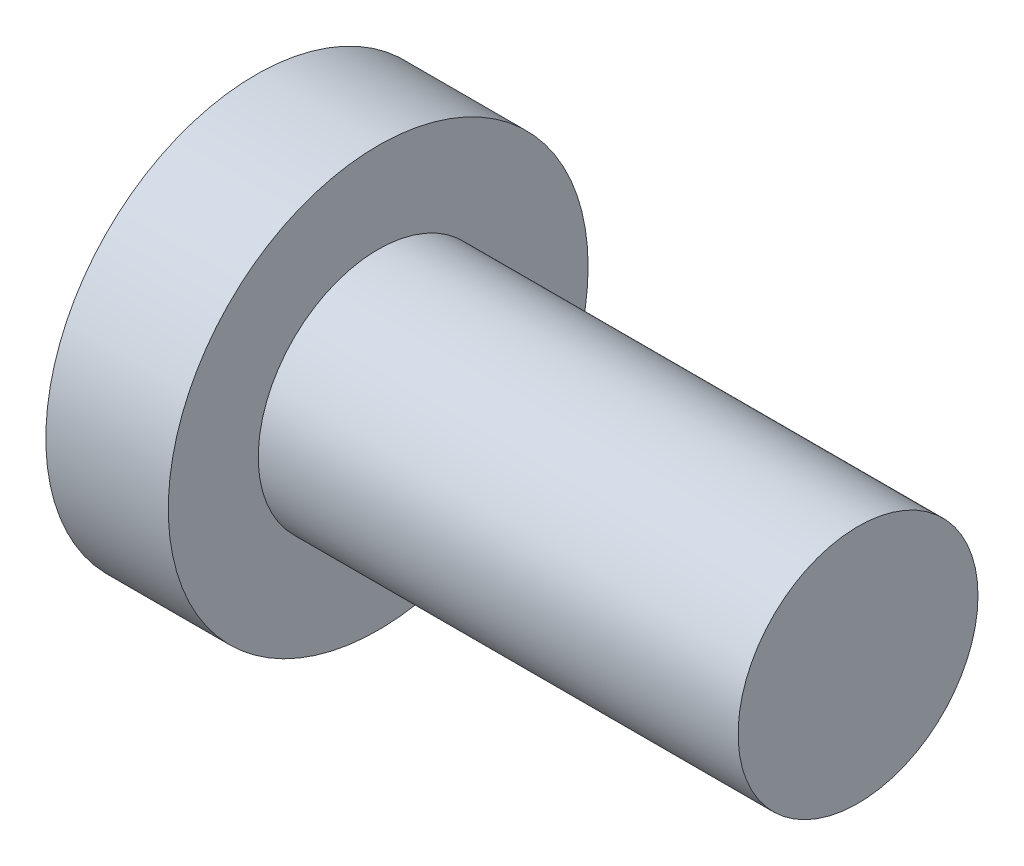
ISO-10303-21;
HEADER;
FILE_DESCRIPTION(('STEP AP214'),'2;1');
FILE_NAME('part.step','',(''),(''),'','','');
FILE_SCHEMA(('AUTOMOTIVE_DESIGN { 1 0 10303 214 1 1 1 1 }'));
ENDSEC;
DATA;
#1=APPLICATION_CONTEXT('core data for automotive mechanical design processes');
#2=APPLICATION_PROTOCOL_DEFINITION('international standard','automotive_design',2000,#1);
#3=PRODUCT_CONTEXT('',#1,'mechanical');
#4=PRODUCT('Part','Part','',(#3));
#5=PRODUCT_RELATED_PRODUCT_CATEGORY('part','',(#4));
#6=PRODUCT_DEFINITION_FORMATION('','',#4);
#7=PRODUCT_DEFINITION_CONTEXT('part definition',#1,'design');
#8=PRODUCT_DEFINITION('design','',#6,#7);
#9=PRODUCT_DEFINITION_SHAPE('','',#8);
#10=(LENGTH_UNIT() NAMED_UNIT(*) SI_UNIT(.MILLI.,.METRE.));
#11=(NAMED_UNIT(*) PLANE_ANGLE_UNIT() SI_UNIT($,.RADIAN.));
#12=(NAMED_UNIT(*) SI_UNIT($,.STERADIAN.) SOLID_ANGLE_UNIT());
#13=UNCERTAINTY_MEASURE_WITH_UNIT(LENGTH_MEASURE(1.E-05),#10,'distance_accuracy_value','');
#14=(GEOMETRIC_REPRESENTATION_CONTEXT(3) GLOBAL_UNCERTAINTY_ASSIGNED_CONTEXT((#13)) GLOBAL_UNIT_ASSIGNED_CONTEXT((#10,
#11,#12)) REPRESENTATION_CONTEXT('',''));
#15=CARTESIAN_POINT('',(0.,0.,0.));
#16=DIRECTION('',(0.,0.,1.));
#17=DIRECTION('',(1.,0.,0.));
#18=AXIS2_PLACEMENT_3D('',#15,#16,#17);
#19=CARTESIAN_POINT('',(1.73,0.41,0.41));
#20=DIRECTION('',(0.,-1.,0.));
#21=DIRECTION('',(0.,0.,-1.));
#22=AXIS2_PLACEMENT_3D('',#19,#20,#21);
#23=PLANE('',#22);
#24=DIRECTION('',(0.,0.,-1.));
#25=VECTOR('',#24,1.);
#26=CARTESIAN_POINT('',(1.73,0.41,0.41));
#27=LINE('',#26,#25);
#28=CARTESIAN_POINT('',(1.73,0.41,0.71));
#29=VERTEX_POINT('',#28);
#30=CARTESIAN_POINT('',(1.73,0.41,1.05118403430194));
#31=VERTEX_POINT('',#30);
#32=EDGE_CURVE('E116',#29,#31,#27,.F.);
#33=ORIENTED_EDGE('',*,*,#32,.T.);
#34=DIRECTION('',(-0.866025403784438,0.,0.500000000000001));
#35=VECTOR('',#34,1.);
#36=CARTESIAN_POINT('',(0.,0.41,2.05));
#37=LINE('',#36,#35);
#38=CARTESIAN_POINT('',(0.217693203665265,0.409999999999999,1.92431477026311));
#39=VERTEX_POINT('',#38);
#40=EDGE_CURVE('E257',#39,#31,#37,.F.);
#41=ORIENTED_EDGE('',*,*,#40,.F.);
#42=CARTESIAN_POINT('',(9.,0.409999999999999,0.));
#43=DIRECTION('',(0.,1.,0.));
#44=DIRECTION('',(0.,0.,1.));
#45=AXIS2_PLACEMENT_3D('',#42,#43,#44);
#46=CIRCLE('',#45,8.99065626080766);
#47=CARTESIAN_POINT('',(0.0374222458045014,0.409999999999999,0.71));
#48=VERTEX_POINT('',#47);
#49=EDGE_CURVE('E19',#39,#48,#46,.F.);
#50=ORIENTED_EDGE('',*,*,#49,.T.);
#51=DIRECTION('',(1.,0.,0.));
#52=VECTOR('',#51,1.);
#53=CARTESIAN_POINT('',(1.73,0.41,0.71));
#54=LINE('',#53,#52);
#55=EDGE_CURVE('E266',#48,#29,#54,.T.);
#56=ORIENTED_EDGE('',*,*,#55,.T.);
#57=EDGE_LOOP('',(#33,#41,#50,#56));
#58=FACE_BOUND('',#57,.T.);
#59=ADVANCED_FACE('F16',(#58),#23,.T.);
#60=CARTESIAN_POINT('',(0.,0.,2.05));
#61=DIRECTION('',(-0.500000000000001,0.,-0.866025403784438));
#62=DIRECTION('',(-0.866025403784438,0.,0.500000000000001));
#63=AXIS2_PLACEMENT_3D('',#60,#61,#62);
#64=PLANE('',#63);
#65=DIRECTION('',(0.866025403784438,0.,-0.500000000000001));
#66=VECTOR('',#65,1.);
#67=CARTESIAN_POINT('',(0.217693203665264,-0.41,1.92431477026311));
#68=LINE('',#67,#66);
#69=CARTESIAN_POINT('',(0.217693203665266,-0.410000000000002,1.92431477026311));
#70=VERTEX_POINT('',#69);
#71=CARTESIAN_POINT('',(1.73,-0.41,1.05118403430194));
#72=VERTEX_POINT('',#71);
#73=EDGE_CURVE('E246',#70,#72,#68,.T.);
#74=ORIENTED_EDGE('',*,*,#73,.F.);
#75=CARTESIAN_POINT('',(0.217693203665266,-0.410000000000001,1.92431477026311));
#76=CARTESIAN_POINT('',(0.212032682635899,-0.273333333333334,1.92758287360316));
#77=CARTESIAN_POINT('',(0.209202422121216,-0.136666666666668,1.92921692527319));
#78=CARTESIAN_POINT('',(0.209202422121216,0.136666666666666,1.92921692527319));
#79=CARTESIAN_POINT('',(0.212032682635899,0.273333333333332,1.92758287360316));
#80=CARTESIAN_POINT('',(0.217693203665265,0.409999999999999,1.92431477026311));
#81=B_SPLINE_CURVE_WITH_KNOTS('',3,(#75,#76,#77,#78,#79,#80),.UNSPECIFIED.,.F.,.F.,(4,2,4),(0.,
0.410117208240488,0.820234416480976),.UNSPECIFIED.);
#82=EDGE_CURVE('E254',#70,#39,#81,.T.);
#83=ORIENTED_EDGE('',*,*,#82,.T.);
#84=ORIENTED_EDGE('',*,*,#40,.T.);
#85=DIRECTION('',(0.,1.,0.));
#86=VECTOR('',#85,1.);
#87=CARTESIAN_POINT('',(1.73,0.,1.05118403430194));
#88=LINE('',#87,#86);
#89=EDGE_CURVE('E260',#31,#72,#88,.F.);
#90=ORIENTED_EDGE('',*,*,#89,.T.);
#91=EDGE_LOOP('',(#74,#83,#84,#90));
#92=FACE_BOUND('',#91,.T.);
#93=ADVANCED_FACE('F410',(#92),#64,.T.);
#94=CARTESIAN_POINT('',(1.73,-0.41,0.41));
#95=DIRECTION('',(0.,1.,0.));
#96=DIRECTION('',(0.,0.,1.));
#97=AXIS2_PLACEMENT_3D('',#94,#95,#96);
#98=PLANE('',#97);
#99=CARTESIAN_POINT('',(9.,-0.410000000000002,0.));
#100=DIRECTION('',(0.,1.,0.));
#101=DIRECTION('',(0.,0.,1.));
#102=AXIS2_PLACEMENT_3D('',#99,#100,#101);
#103=CIRCLE('',#102,8.99065626080766);
#104=CARTESIAN_POINT('',(0.0374222458045014,-0.410000000000001,0.71));
#105=VERTEX_POINT('',#104);
#106=EDGE_CURVE('E250',#105,#70,#103,.T.);
#107=ORIENTED_EDGE('',*,*,#106,.T.);
#108=ORIENTED_EDGE('',*,*,#73,.T.);
#109=DIRECTION('',(0.,0.,1.));
#110=VECTOR('',#109,1.);
#111=CARTESIAN_POINT('',(1.73,-0.41,0.41));
#112=LINE('',#111,#110);
#113=CARTESIAN_POINT('',(1.73,-0.41,0.71));
#114=VERTEX_POINT('',#113);
#115=EDGE_CURVE('E121',#72,#114,#112,.F.);
#116=ORIENTED_EDGE('',*,*,#115,.T.);
#117=DIRECTION('',(-1.,0.,0.));
#118=VECTOR('',#117,1.);
#119=CARTESIAN_POINT('',(1.73,-0.41,0.71));
#120=LINE('',#119,#118);
#121=EDGE_CURVE('E242',#105,#114,#120,.F.);
#122=ORIENTED_EDGE('',*,*,#121,.F.);
#123=EDGE_LOOP('',(#107,#108,#116,#122));
#124=FACE_BOUND('',#123,.T.);
#125=ADVANCED_FACE('F407',(#124),#98,.T.);
#126=CARTESIAN_POINT('',(1.73,-0.71,0.71));
#127=DIRECTION('',(-1.,0.,0.));
#128=DIRECTION('',(0.,0.,1.));
#129=AXIS2_PLACEMENT_3D('',#126,#127,#128);
#130=CYLINDRICAL_SURFACE('',#129,0.3);
#131=CARTESIAN_POINT('',(0.0374222458045004,-0.709999999999999,0.41));
#132=CARTESIAN_POINT('',(0.0360902146569574,-0.693199764468953,0.409985500134879));
#133=CARTESIAN_POINT('',(0.0348720059909341,-0.676393239820481,0.411410443560751));
#134=CARTESIAN_POINT('',(0.0326932036830023,-0.643246108321254,0.417042649974218));
#135=CARTESIAN_POINT('',(0.0317324525768679,-0.626905222171337,0.421248206821196));
#136=CARTESIAN_POINT('',(0.0300963254925678,-0.595136310328254,0.432348715855054));
#137=CARTESIAN_POINT('',(0.0294211261442148,-0.579708854701642,0.439245327555193));
#138=CARTESIAN_POINT('',(0.0283764097281757,-0.550223813119101,0.455530012989652));
#139=CARTESIAN_POINT('',(0.0280068188067173,-0.536165896923159,0.464917484054561));
#140=CARTESIAN_POINT('',(0.027584688687033,-0.509864105590666,0.485884856413318));
#141=CARTESIAN_POINT('',(0.0275311048054595,-0.497614383874342,0.497457402990929));
#142=CARTESIAN_POINT('',(0.0277397625411455,-0.475222878776901,0.522485743138664));
#143=CARTESIAN_POINT('',(0.0280019985070131,-0.465081057680075,0.535941503006097));
#144=CARTESIAN_POINT('',(0.0288339870193502,-0.447203354117664,0.564332236500039));
#145=CARTESIAN_POINT('',(0.0294033547598211,-0.439464480071298,0.579265340082127));
#146=CARTESIAN_POINT('',(0.0308329687914648,-0.42659214792812,0.610198890644394));
#147=CARTESIAN_POINT('',(0.0316930729203549,-0.421457419536364,0.626198812915354));
#148=CARTESIAN_POINT('',(0.0333597741328461,-0.415135214966729,0.653571483727267));
#149=CARTESIAN_POINT('',(0.0340951974398791,-0.413210121060783,0.664784034391672));
#150=CARTESIAN_POINT('',(0.0356774829770485,-0.410642556681798,0.687330990569974));
#151=CARTESIAN_POINT('',(0.0365241847230453,-0.409998260238825,0.698665199414381));
#152=CARTESIAN_POINT('',(0.0374222458045019,-0.410000000000002,0.709999999999999));
#153=B_SPLINE_CURVE_WITH_KNOTS('',3,(#131,#132,#133,#134,#135,#136,#137,#138,#139,#140,#141,
#142,#143,#144,#145,#146,#147,#148,#149,#150,#151,#152),.UNSPECIFIED.,.F.,.F.,(4,2,2,2,2,2,2,2,
2,2,4),(0.,0.0504945099194964,0.100958065919524,0.151452790972037,0.201935309827366,
0.252250845246174,0.302565480314419,0.352817222002445,0.403044427398205,0.43717657082247,
0.471260018731283),.UNSPECIFIED.);
#154=CARTESIAN_POINT('',(0.0374222458045005,-0.71,0.41));
#155=VERTEX_POINT('',#154);
#156=EDGE_CURVE('E245',#155,#105,#153,.T.);
#157=ORIENTED_EDGE('',*,*,#156,.T.);
#158=ORIENTED_EDGE('',*,*,#121,.T.);
#159=CARTESIAN_POINT('',(1.73,-0.71,0.71));
#160=DIRECTION('',(-1.,0.,0.));
#161=DIRECTION('',(0.,0.,1.));
#162=AXIS2_PLACEMENT_3D('',#159,#160,#161);
#163=CIRCLE('',#162,0.3);
#164=CARTESIAN_POINT('',(1.73,-0.71,0.41));
#165=VERTEX_POINT('',#164);
#166=EDGE_CURVE('E249',#114,#165,#163,.T.);
#167=ORIENTED_EDGE('',*,*,#166,.T.);
#168=DIRECTION('',(1.,0.,0.));
#169=VECTOR('',#168,1.);
#170=CARTESIAN_POINT('',(1.73,-0.71,0.41));
#171=LINE('',#170,#169);
#172=EDGE_CURVE('E235',#155,#165,#171,.T.);
#173=ORIENTED_EDGE('',*,*,#172,.F.);
#174=EDGE_LOOP('',(#157,#158,#167,#173));
#175=FACE_BOUND('',#174,.T.);
#176=ADVANCED_FACE('F402',(#175),#130,.T.);
#177=CARTESIAN_POINT('',(1.73,-0.41,0.41));
#178=DIRECTION('',(0.,0.,-1.));
#179=DIRECTION('',(0.,1.,0.));
#180=AXIS2_PLACEMENT_3D('',#177,#178,#179);
#181=PLANE('',#180);
#182=DIRECTION('',(0.,1.,0.));
#183=VECTOR('',#182,1.);
#184=CARTESIAN_POINT('',(1.73,-0.41,0.41));
#185=LINE('',#184,#183);
#186=CARTESIAN_POINT('',(1.73,-1.05118403430194,0.409999999999999));
#187=VERTEX_POINT('',#186);
#188=EDGE_CURVE('E228',#165,#187,#185,.F.);
#189=ORIENTED_EDGE('',*,*,#188,.T.);
#190=DIRECTION('',(-0.866025403784438,-0.500000000000001,0.));
#191=VECTOR('',#190,1.);
#192=CARTESIAN_POINT('',(0.,-2.05,0.409999999999999));
#193=LINE('',#192,#191);
#194=CARTESIAN_POINT('',(0.217693203665265,-1.92431477026311,0.409999999999999));
#195=VERTEX_POINT('',#194);
#196=EDGE_CURVE('E224',#195,#187,#193,.F.);
#197=ORIENTED_EDGE('',*,*,#196,.F.);
#198=CARTESIAN_POINT('',(0.217693203665265,-1.92431477026311,0.409999999999999));
#199=CARTESIAN_POINT('',(0.173814591743695,-1.72398261876685,0.409999999999999));
#200=CARTESIAN_POINT('',(0.13685270596118,-1.52262364549679,0.409999999999999));
#201=CARTESIAN_POINT('',(0.0767623866742589,-1.11785205540909,0.409999999999999));
#202=CARTESIAN_POINT('',(0.0536339531698525,-0.914439438591442,0.409999999999999));
#203=CARTESIAN_POINT('',(0.0374222458045004,-0.709999999999999,0.409999999999999));
#204=B_SPLINE_CURVE_WITH_KNOTS('',3,(#198,#199,#200,#201,#202,#203),.UNSPECIFIED.,.F.,.F.,(4,2,
4),(0.,0.614169808809206,1.22833961761841),.UNSPECIFIED.);
#205=EDGE_CURVE('E238',#195,#155,#204,.T.);
#206=ORIENTED_EDGE('',*,*,#205,.T.);
#207=ORIENTED_EDGE('',*,*,#172,.T.);
#208=EDGE_LOOP('',(#189,#197,#206,#207));
#209=FACE_BOUND('',#208,.T.);
#210=ADVANCED_FACE('F399',(#209),#181,.T.);
#211=CARTESIAN_POINT('',(0.,-2.05,0.));
#212=DIRECTION('',(-0.500000000000001,0.866025403784438,0.));
#213=DIRECTION('',(-0.866025403784438,-0.500000000000001,0.));
#214=AXIS2_PLACEMENT_3D('',#211,#212,#213);
#215=PLANE('',#214);
#216=DIRECTION('',(0.866025403784438,0.500000000000001,0.));
#217=VECTOR('',#216,1.);
#218=CARTESIAN_POINT('',(0.217693203665265,-1.92431477026311,-0.41));
#219=LINE('',#218,#217);
#220=CARTESIAN_POINT('',(0.217693203665265,-1.92431477026311,-0.410000000000002));
#221=VERTEX_POINT('',#220);
#222=CARTESIAN_POINT('',(1.73,-1.05118403430194,-0.41));
#223=VERTEX_POINT('',#222);
#224=EDGE_CURVE('E211',#221,#223,#219,.T.);
#225=ORIENTED_EDGE('',*,*,#224,.F.);
#226=CARTESIAN_POINT('',(0.217693203665265,-1.92431477026311,-0.410000000000003));
#227=CARTESIAN_POINT('',(0.212032682635899,-1.92758287360316,-0.273333333333335));
#228=CARTESIAN_POINT('',(0.209202422121216,-1.92921692527319,-0.136666666666668));
#229=CARTESIAN_POINT('',(0.209202422121217,-1.92921692527319,0.136666666666666));
#230=CARTESIAN_POINT('',(0.2120326826359,-1.92758287360317,0.273333333333333));
#231=CARTESIAN_POINT('',(0.217693203665266,-1.92431477026311,0.409999999999999));
#232=B_SPLINE_CURVE_WITH_KNOTS('',3,(#226,#227,#228,#229,#230,#231),.UNSPECIFIED.,.F.,.F.,(4,2,
4),(0.,0.410117208240491,0.820234416480978),.UNSPECIFIED.);
#233=EDGE_CURVE('E221',#221,#195,#232,.T.);
#234=ORIENTED_EDGE('',*,*,#233,.T.);
#235=ORIENTED_EDGE('',*,*,#196,.T.);
#236=DIRECTION('',(0.,0.,1.));
#237=VECTOR('',#236,1.);
#238=CARTESIAN_POINT('',(1.73,-1.05118403430194,0.));
#239=LINE('',#238,#237);
#240=EDGE_CURVE('E227',#187,#223,#239,.F.);
#241=ORIENTED_EDGE('',*,*,#240,.T.);
#242=EDGE_LOOP('',(#225,#234,#235,#241));
#243=FACE_BOUND('',#242,.T.);
#244=ADVANCED_FACE('F371',(#243),#215,.T.);
#245=CARTESIAN_POINT('',(1.73,-0.41,-0.41));
#246=DIRECTION('',(0.,0.,1.));
#247=DIRECTION('',(0.,-1.,0.));
#248=AXIS2_PLACEMENT_3D('',#245,#246,#247);
#249=PLANE('',#248);
#250=CARTESIAN_POINT('',(0.0374222458045004,-0.709999999999999,-0.41));
#251=CARTESIAN_POINT('',(0.0536339531698525,-0.914439438591442,-0.409999999999999));
#252=CARTESIAN_POINT('',(0.0767623866742589,-1.11785205540909,-0.409999999999999));
#253=CARTESIAN_POINT('',(0.13685270596118,-1.52262364549679,-0.410000000000001));
#254=CARTESIAN_POINT('',(0.173814591743695,-1.72398261876685,-0.410000000000003));
#255=CARTESIAN_POINT('',(0.217693203665265,-1.92431477026311,-0.410000000000006));
#256=B_SPLINE_CURVE_WITH_KNOTS('',3,(#250,#251,#252,#253,#254,#255),.UNSPECIFIED.,.F.,.F.,(4,2,
4),(0.,0.614169808809206,1.22833961761841),.UNSPECIFIED.);
#257=CARTESIAN_POINT('',(0.0374222458045005,-0.71,-0.41));
#258=VERTEX_POINT('',#257);
#259=EDGE_CURVE('E215',#258,#221,#256,.T.);
#260=ORIENTED_EDGE('',*,*,#259,.T.);
#261=ORIENTED_EDGE('',*,*,#224,.T.);
#262=DIRECTION('',(0.,-1.,0.));
#263=VECTOR('',#262,1.);
#264=CARTESIAN_POINT('',(1.73,-0.41,-0.41));
#265=LINE('',#264,#263);
#266=CARTESIAN_POINT('',(1.73,-0.71,-0.41));
#267=VERTEX_POINT('',#266);
#268=EDGE_CURVE('E218',#223,#267,#265,.F.);
#269=ORIENTED_EDGE('',*,*,#268,.T.);
#270=DIRECTION('',(-1.,0.,0.));
#271=VECTOR('',#270,1.);
#272=CARTESIAN_POINT('',(1.73,-0.71,-0.41));
#273=LINE('',#272,#271);
#274=EDGE_CURVE('E207',#258,#267,#273,.F.);
#275=ORIENTED_EDGE('',*,*,#274,.F.);
#276=EDGE_LOOP('',(#260,#261,#269,#275));
#277=FACE_BOUND('',#276,.T.);
#278=ADVANCED_FACE('F366',(#277),#249,.T.);
#279=CARTESIAN_POINT('',(1.73,-0.71,-0.71));
#280=DIRECTION('',(-1.,0.,0.));
#281=DIRECTION('',(0.,0.,1.));
#282=AXIS2_PLACEMENT_3D('',#279,#280,#281);
#283=CYLINDRICAL_SURFACE('',#282,0.3);
#284=CARTESIAN_POINT('',(0.0374222458045029,-0.410000000000001,-0.710000000000006));
#285=CARTESIAN_POINT('',(0.0360902146569592,-0.409985500134879,-0.69319976446896));
#286=CARTESIAN_POINT('',(0.0348720059909357,-0.41141044356075,-0.676393239820489));
#287=CARTESIAN_POINT('',(0.0326932036830039,-0.417042649974216,-0.643246108321262));
#288=CARTESIAN_POINT('',(0.0317324525768696,-0.421248206821195,-0.626905222171346));
#289=CARTESIAN_POINT('',(0.0300963254925686,-0.432348715855052,-0.595136310328262));
#290=CARTESIAN_POINT('',(0.0294211261442147,-0.439245327555191,-0.57970885470165));
#291=CARTESIAN_POINT('',(0.028376409728176,-0.455530012989648,-0.550223813119105));
#292=CARTESIAN_POINT('',(0.0280068188067189,-0.464917484054554,-0.536165896923161));
#293=CARTESIAN_POINT('',(0.0275846886870347,-0.485884856413311,-0.509864105590667));
#294=CARTESIAN_POINT('',(0.0275311048054601,-0.497457402990925,-0.497614383874346));
#295=CARTESIAN_POINT('',(0.027739762541146,-0.52248574313866,-0.475222878776904));
#296=CARTESIAN_POINT('',(0.0280019985070147,-0.53594150300609,-0.465081057680074));
#297=CARTESIAN_POINT('',(0.02883398701935,-0.564332236500031,-0.447203354117662));
#298=CARTESIAN_POINT('',(0.0294033547598179,-0.579265340082121,-0.439464480071301));
#299=CARTESIAN_POINT('',(0.030832968791462,-0.610198890644389,-0.426592147928121));
#300=CARTESIAN_POINT('',(0.0316930729203553,-0.626198812915346,-0.421457419536358));
#301=CARTESIAN_POINT('',(0.0333597741328469,-0.65357148372726,-0.415135214966724));
#302=CARTESIAN_POINT('',(0.0340951974398786,-0.664784034391667,-0.413210121060781));
#303=CARTESIAN_POINT('',(0.0356774829770462,-0.687330990569972,-0.4106425566818));
#304=CARTESIAN_POINT('',(0.0365241847230424,-0.698665199414381,-0.409998260238829));
#305=CARTESIAN_POINT('',(0.0374222458045004,-0.709999999999999,-0.41));
#306=B_SPLINE_CURVE_WITH_KNOTS('',3,(#284,#285,#286,#287,#288,#289,#290,#291,#292,#293,#294,
#295,#296,#297,#298,#299,#300,#301,#302,#303,#304,#305),.UNSPECIFIED.,.F.,.F.,(4,2,2,2,2,2,2,2,
2,2,4),(0.,0.0504945099194944,0.100958065919521,0.151452790972036,0.201935309827367,
0.252250845246175,0.302565480314421,0.352817222002447,0.403044427398207,0.437176570822475,
0.471260018731292),.UNSPECIFIED.);
#307=CARTESIAN_POINT('',(0.0374222458045026,-0.410000000000002,-0.710000000000003));
#308=VERTEX_POINT('',#307);
#309=EDGE_CURVE('E210',#308,#258,#306,.T.);
#310=ORIENTED_EDGE('',*,*,#309,.T.);
#311=ORIENTED_EDGE('',*,*,#274,.T.);
#312=CARTESIAN_POINT('',(1.73,-0.71,-0.71));
#313=DIRECTION('',(-1.,0.,0.));
#314=DIRECTION('',(0.,0.,1.));
#315=AXIS2_PLACEMENT_3D('',#312,#313,#314);
#316=CIRCLE('',#315,0.3);
#317=CARTESIAN_POINT('',(1.73,-0.41,-0.71));
#318=VERTEX_POINT('',#317);
#319=EDGE_CURVE('E214',#267,#318,#316,.T.);
#320=ORIENTED_EDGE('',*,*,#319,.T.);
#321=DIRECTION('',(1.,0.,0.));
#322=VECTOR('',#321,1.);
#323=CARTESIAN_POINT('',(1.73,-0.41,-0.71));
#324=LINE('',#323,#322);
#325=EDGE_CURVE('E200',#308,#318,#324,.T.);
#326=ORIENTED_EDGE('',*,*,#325,.F.);
#327=EDGE_LOOP('',(#310,#311,#320,#326));
#328=FACE_BOUND('',#327,.T.);
#329=ADVANCED_FACE('F362',(#328),#283,.T.);
#330=CARTESIAN_POINT('',(1.73,-0.41,-0.41));
#331=DIRECTION('',(0.,1.,0.));
#332=DIRECTION('',(0.,0.,1.));
#333=AXIS2_PLACEMENT_3D('',#330,#331,#332);
#334=PLANE('',#333);
#335=DIRECTION('',(0.,0.,1.));
#336=VECTOR('',#335,1.);
#337=CARTESIAN_POINT('',(1.73,-0.41,-0.41));
#338=LINE('',#337,#336);
#339=CARTESIAN_POINT('',(1.73,-0.41,-1.05118403430194));
#340=VERTEX_POINT('',#339);
#341=EDGE_CURVE('E192',#318,#340,#338,.F.);
#342=ORIENTED_EDGE('',*,*,#341,.T.);
#343=DIRECTION('',(0.866025403784438,0.,0.500000000000001));
#344=VECTOR('',#343,1.);
#345=CARTESIAN_POINT('',(0.,-0.41,-2.05));
#346=LINE('',#345,#344);
#347=CARTESIAN_POINT('',(0.217693203665265,-0.410000000000001,-1.92431477026311));
#348=VERTEX_POINT('',#347);
#349=EDGE_CURVE('E188',#348,#340,#346,.T.);
#350=ORIENTED_EDGE('',*,*,#349,.F.);
#351=CARTESIAN_POINT('',(9.,-0.410000000000002,0.));
#352=DIRECTION('',(0.,1.,0.));
#353=DIRECTION('',(0.,0.,1.));
#354=AXIS2_PLACEMENT_3D('',#351,#352,#353);
#355=CIRCLE('',#354,8.99065626080766);
#356=EDGE_CURVE('E203',#348,#308,#355,.T.);
#357=ORIENTED_EDGE('',*,*,#356,.T.);
#358=ORIENTED_EDGE('',*,*,#325,.T.);
#359=EDGE_LOOP('',(#342,#350,#357,#358));
#360=FACE_BOUND('',#359,.T.);
#361=ADVANCED_FACE('F344',(#360),#334,.T.);
#362=CARTESIAN_POINT('',(0.,0.,-2.05));
#363=DIRECTION('',(-0.500000000000001,0.,0.866025403784438));
#364=DIRECTION('',(0.866025403784438,0.,0.500000000000001));
#365=AXIS2_PLACEMENT_3D('',#362,#363,#364);
#366=PLANE('',#365);
#367=DIRECTION('',(0.866025403784438,0.,0.500000000000001));
#368=VECTOR('',#367,1.);
#369=CARTESIAN_POINT('',(0.217693203665264,0.41,-1.92431477026311));
#370=LINE('',#369,#368);
#371=CARTESIAN_POINT('',(0.217693203665265,0.409999999999999,-1.92431477026311));
#372=VERTEX_POINT('',#371);
#373=CARTESIAN_POINT('',(1.73,0.41,-1.05118403430194));
#374=VERTEX_POINT('',#373);
#375=EDGE_CURVE('E177',#372,#374,#370,.T.);
#376=ORIENTED_EDGE('',*,*,#375,.F.);
#377=CARTESIAN_POINT('',(0.217693203665266,0.409999999999999,-1.92431477026311));
#378=CARTESIAN_POINT('',(0.212032682635899,0.273333333333333,-1.92758287360317));
#379=CARTESIAN_POINT('',(0.209202422121216,0.136666666666666,-1.92921692527319));
#380=CARTESIAN_POINT('',(0.209202422121216,-0.136666666666666,-1.92921692527319));
#381=CARTESIAN_POINT('',(0.212032682635899,-0.273333333333333,-1.92758287360317));
#382=CARTESIAN_POINT('',(0.217693203665266,-0.409999999999999,-1.92431477026311));
#383=B_SPLINE_CURVE_WITH_KNOTS('',3,(#377,#378,#379,#380,#381,#382),.UNSPECIFIED.,.F.,.F.,(4,2,
4),(0.,0.410117208240487,0.820234416480974),.UNSPECIFIED.);
#384=EDGE_CURVE('E197',#372,#348,#383,.T.);
#385=ORIENTED_EDGE('',*,*,#384,.T.);
#386=ORIENTED_EDGE('',*,*,#349,.T.);
#387=DIRECTION('',(0.,1.,0.));
#388=VECTOR('',#387,1.);
#389=CARTESIAN_POINT('',(1.73,0.,-1.05118403430194));
#390=LINE('',#389,#388);
#391=EDGE_CURVE('E191',#340,#374,#390,.T.);
#392=ORIENTED_EDGE('',*,*,#391,.T.);
#393=EDGE_LOOP('',(#376,#385,#386,#392));
#394=FACE_BOUND('',#393,.T.);
#395=ADVANCED_FACE('F339',(#394),#366,.T.);
#396=CARTESIAN_POINT('',(1.73,0.71,0.71));
#397=DIRECTION('',(-1.,0.,0.));
#398=DIRECTION('',(0.,0.,1.));
#399=AXIS2_PLACEMENT_3D('',#396,#397,#398);
#400=CYLINDRICAL_SURFACE('',#399,0.3);
#401=CARTESIAN_POINT('',(0.0374222458045019,0.409999999999999,0.71));
#402=CARTESIAN_POINT('',(0.036090214656957,0.409985500134878,0.693199764468954));
#403=CARTESIAN_POINT('',(0.0348720059909337,0.411410443560751,0.676393239820482));
#404=CARTESIAN_POINT('',(0.0326932036830027,0.417042649974218,0.643246108321255));
#405=CARTESIAN_POINT('',(0.0317324525768692,0.421248206821196,0.626905222171339));
#406=CARTESIAN_POINT('',(0.030096325492569,0.432348715855054,0.595136310328256));
#407=CARTESIAN_POINT('',(0.0294211261442149,0.439245327555193,0.579708854701644));
#408=CARTESIAN_POINT('',(0.0283764097281755,0.455530012989652,0.550223813119101));
#409=CARTESIAN_POINT('',(0.0280068188067179,0.46491748405456,0.536165896923159));
#410=CARTESIAN_POINT('',(0.0275846886870336,0.485884856413316,0.509864105590666));
#411=CARTESIAN_POINT('',(0.0275311048054595,0.497457402990928,0.497614383874342));
#412=CARTESIAN_POINT('',(0.0277397625411457,0.522485743138663,0.475222878776902));
#413=CARTESIAN_POINT('',(0.0280019985070143,0.535941503006096,0.465081057680076));
#414=CARTESIAN_POINT('',(0.0288339870193504,0.564332236500037,0.447203354117665));
#415=CARTESIAN_POINT('',(0.0294033547598193,0.579265340082125,0.439464480071299));
#416=CARTESIAN_POINT('',(0.0308329687914633,0.610198890644393,0.42659214792812));
#417=CARTESIAN_POINT('',(0.0316930729203557,0.626198812915352,0.421457419536362));
#418=CARTESIAN_POINT('',(0.0333597741328466,0.653571483727266,0.415135214966728));
#419=CARTESIAN_POINT('',(0.0340951974398784,0.664784034391671,0.413210121060782));
#420=CARTESIAN_POINT('',(0.035677482977046,0.687330990569974,0.410642556681798));
#421=CARTESIAN_POINT('',(0.0365241847230424,0.698665199414382,0.409998260238826));
#422=CARTESIAN_POINT('',(0.0374222458045004,0.71,0.41));
#423=B_SPLINE_CURVE_WITH_KNOTS('',3,(#401,#402,#403,#404,#405,#406,#407,#408,#409,#410,#411,
#412,#413,#414,#415,#416,#417,#418,#419,#420,#421,#422),.UNSPECIFIED.,.F.,.F.,(4,2,2,2,2,2,2,2,
2,2,4),(0.,0.0504945099194957,0.100958065919523,0.151452790972036,0.201935309827366,
0.252250845246173,0.302565480314418,0.352817222002445,0.403044427398205,0.437176570822471,
0.471260018731284),.UNSPECIFIED.);
#424=CARTESIAN_POINT('',(0.0374222458045004,0.71,0.41));
#425=VERTEX_POINT('',#424);
#426=EDGE_CURVE('E185',#48,#425,#423,.T.);
#427=ORIENTED_EDGE('',*,*,#426,.T.);
#428=DIRECTION('',(1.,0.,0.));
#429=VECTOR('',#428,1.);
#430=CARTESIAN_POINT('',(1.73,0.71,0.41));
#431=LINE('',#430,#429);
#432=CARTESIAN_POINT('',(1.73,0.71,0.41));
#433=VERTEX_POINT('',#432);
#434=EDGE_CURVE('E173',#433,#425,#431,.F.);
#435=ORIENTED_EDGE('',*,*,#434,.F.);
#436=CARTESIAN_POINT('',(1.73,0.71,0.71));
#437=DIRECTION('',(-1.,0.,0.));
#438=DIRECTION('',(0.,0.,1.));
#439=AXIS2_PLACEMENT_3D('',#436,#437,#438);
#440=CIRCLE('',#439,0.3);
#441=EDGE_CURVE('E332',#433,#29,#440,.T.);
#442=ORIENTED_EDGE('',*,*,#441,.T.);
#443=ORIENTED_EDGE('',*,*,#55,.F.);
#444=EDGE_LOOP('',(#427,#435,#442,#443));
#445=FACE_BOUND('',#444,.T.);
#446=ADVANCED_FACE('F334',(#445),#400,.T.);
#447=CARTESIAN_POINT('',(1.73,0.41,-0.41));
#448=DIRECTION('',(0.,-1.,0.));
#449=DIRECTION('',(0.,0.,-1.));
#450=AXIS2_PLACEMENT_3D('',#447,#448,#449);
#451=PLANE('',#450);
#452=CARTESIAN_POINT('',(9.,0.409999999999998,0.));
#453=DIRECTION('',(0.,1.,0.));
#454=DIRECTION('',(0.,0.,1.));
#455=AXIS2_PLACEMENT_3D('',#452,#453,#454);
#456=CIRCLE('',#455,8.99065626080766);
#457=CARTESIAN_POINT('',(0.0374222458045014,0.409999999999999,-0.71));
#458=VERTEX_POINT('',#457);
#459=EDGE_CURVE('E180',#458,#372,#456,.F.);
#460=ORIENTED_EDGE('',*,*,#459,.T.);
#461=ORIENTED_EDGE('',*,*,#375,.T.);
#462=DIRECTION('',(0.,0.,-1.));
#463=VECTOR('',#462,1.);
#464=CARTESIAN_POINT('',(1.73,0.41,-0.41));
#465=LINE('',#464,#463);
#466=CARTESIAN_POINT('',(1.73,0.41,-0.71));
#467=VERTEX_POINT('',#466);
#468=EDGE_CURVE('E183',#374,#467,#465,.F.);
#469=ORIENTED_EDGE('',*,*,#468,.T.);
#470=DIRECTION('',(-1.,0.,0.));
#471=VECTOR('',#470,1.);
#472=CARTESIAN_POINT('',(1.73,0.41,-0.71));
#473=LINE('',#472,#471);
#474=EDGE_CURVE('E167',#458,#467,#473,.F.);
#475=ORIENTED_EDGE('',*,*,#474,.F.);
#476=EDGE_LOOP('',(#460,#461,#469,#475));
#477=FACE_BOUND('',#476,.T.);
#478=ADVANCED_FACE('F338',(#477),#451,.T.);
#479=CARTESIAN_POINT('',(1.73,0.41,0.41));
#480=DIRECTION('',(0.,0.,-1.));
#481=DIRECTION('',(0.,1.,0.));
#482=AXIS2_PLACEMENT_3D('',#479,#480,#481);
#483=PLANE('',#482);
#484=CARTESIAN_POINT('',(0.0374222458045004,0.71,0.41));
#485=CARTESIAN_POINT('',(0.0536339531698525,0.914439438591442,0.41));
#486=CARTESIAN_POINT('',(0.076762386674259,1.11785205540909,0.41));
#487=CARTESIAN_POINT('',(0.13685270596118,1.52262364549679,0.41));
#488=CARTESIAN_POINT('',(0.173814591743695,1.72398261876685,0.409999999999999));
#489=CARTESIAN_POINT('',(0.217693203665265,1.92431477026311,0.409999999999998));
#490=B_SPLINE_CURVE_WITH_KNOTS('',3,(#484,#485,#486,#487,#488,#489),.UNSPECIFIED.,.F.,.F.,(4,2,
4),(0.,0.614169808809205,1.22833961761841),.UNSPECIFIED.);
#491=CARTESIAN_POINT('',(0.217693203665265,1.92431477026311,0.41));
#492=VERTEX_POINT('',#491);
#493=EDGE_CURVE('E176',#425,#492,#490,.T.);
#494=ORIENTED_EDGE('',*,*,#493,.T.);
#495=DIRECTION('',(0.866025403784438,-0.500000000000001,0.));
#496=VECTOR('',#495,1.);
#497=CARTESIAN_POINT('',(0.,2.05,0.41));
#498=LINE('',#497,#496);
#499=CARTESIAN_POINT('',(1.73,1.05118403430194,0.41));
#500=VERTEX_POINT('',#499);
#501=EDGE_CURVE('E146',#500,#492,#498,.F.);
#502=ORIENTED_EDGE('',*,*,#501,.F.);
#503=DIRECTION('',(0.,1.,0.));
#504=VECTOR('',#503,1.);
#505=CARTESIAN_POINT('',(1.73,0.41,0.41));
#506=LINE('',#505,#504);
#507=EDGE_CURVE('E144',#433,#500,#506,.T.);
#508=ORIENTED_EDGE('',*,*,#507,.F.);
#509=ORIENTED_EDGE('',*,*,#434,.T.);
#510=EDGE_LOOP('',(#494,#502,#508,#509));
#511=FACE_BOUND('',#510,.T.);
#512=ADVANCED_FACE('F307',(#511),#483,.T.);
#513=CARTESIAN_POINT('',(1.73,0.71,-0.71));
#514=DIRECTION('',(-1.,0.,0.));
#515=DIRECTION('',(0.,0.,1.));
#516=AXIS2_PLACEMENT_3D('',#513,#514,#515);
#517=CYLINDRICAL_SURFACE('',#516,0.3);
#518=CARTESIAN_POINT('',(0.0374222458045004,0.71,-0.41));
#519=CARTESIAN_POINT('',(0.0360902146569572,0.693199764468953,-0.409985500134877));
#520=CARTESIAN_POINT('',(0.0348720059909338,0.676393239820483,-0.41141044356075));
#521=CARTESIAN_POINT('',(0.0326932036830021,0.643246108321257,-0.417042649974219));
#522=CARTESIAN_POINT('',(0.0317324525768679,0.626905222171341,-0.421248206821199));
#523=CARTESIAN_POINT('',(0.0300963254925679,0.595136310328257,-0.432348715855057));
#524=CARTESIAN_POINT('',(0.0294211261442149,0.579708854701644,-0.439245327555195));
#525=CARTESIAN_POINT('',(0.0283764097281758,0.550223813119101,-0.455530012989651));
#526=CARTESIAN_POINT('',(0.0280068188067174,0.536165896923158,-0.464917484054558));
#527=CARTESIAN_POINT('',(0.0275846886870329,0.509864105590665,-0.485884856413314));
#528=CARTESIAN_POINT('',(0.0275311048054593,0.497614383874342,-0.497457402990926));
#529=CARTESIAN_POINT('',(0.0277397625411455,0.475222878776904,-0.522485743138664));
#530=CARTESIAN_POINT('',(0.0280019985070136,0.465081057680079,-0.535941503006099));
#531=CARTESIAN_POINT('',(0.0288339870193497,0.447203354117668,-0.56433223650004));
#532=CARTESIAN_POINT('',(0.0294033547598192,0.4394644800713,-0.579265340082126));
#533=CARTESIAN_POINT('',(0.030832968791463,0.426592147928119,-0.61019889064439));
#534=CARTESIAN_POINT('',(0.0316930729203546,0.421457419536362,-0.626198812915348));
#535=CARTESIAN_POINT('',(0.0333597741328465,0.415135214966728,-0.653571483727262));
#536=CARTESIAN_POINT('',(0.0340951974398794,0.413210121060782,-0.664784034391669));
#537=CARTESIAN_POINT('',(0.0356774829770487,0.410642556681798,-0.687330990569976));
#538=CARTESIAN_POINT('',(0.0365241847230455,0.409998260238825,-0.698665199414386));
#539=CARTESIAN_POINT('',(0.0374222458045029,0.409999999999998,-0.710000000000006));
#540=B_SPLINE_CURVE_WITH_KNOTS('',3,(#518,#519,#520,#521,#522,#523,#524,#525,#526,#527,#528,
#529,#530,#531,#532,#533,#534,#535,#536,#537,#538,#539),.UNSPECIFIED.,.F.,.F.,(4,2,2,2,2,2,2,2,
2,2,4),(0.,0.0504945099194938,0.100958065919522,0.151452790972036,0.201935309827364,
0.252250845246172,0.302565480314418,0.352817222002442,0.403044427398198,0.43717657082247,
0.471260018731289),.UNSPECIFIED.);
#541=CARTESIAN_POINT('',(0.0374222458045005,0.71,-0.41));
#542=VERTEX_POINT('',#541);
#543=EDGE_CURVE('E172',#542,#458,#540,.T.);
#544=ORIENTED_EDGE('',*,*,#543,.T.);
#545=ORIENTED_EDGE('',*,*,#474,.T.);
#546=CARTESIAN_POINT('',(1.73,0.71,-0.71));
#547=DIRECTION('',(-1.,0.,0.));
#548=DIRECTION('',(0.,0.,1.));
#549=AXIS2_PLACEMENT_3D('',#546,#547,#548);
#550=CIRCLE('',#549,0.3);
#551=CARTESIAN_POINT('',(1.73,0.71,-0.41));
#552=VERTEX_POINT('',#551);
#553=EDGE_CURVE('E147',#552,#467,#550,.F.);
#554=ORIENTED_EDGE('',*,*,#553,.F.);
#555=DIRECTION('',(1.,0.,0.));
#556=VECTOR('',#555,1.);
#557=CARTESIAN_POINT('',(1.73,0.71,-0.41));
#558=LINE('',#557,#556);
#559=EDGE_CURVE('E158',#542,#552,#558,.T.);
#560=ORIENTED_EDGE('',*,*,#559,.F.);
#561=EDGE_LOOP('',(#544,#545,#554,#560));
#562=FACE_BOUND('',#561,.T.);
#563=ADVANCED_FACE('F303',(#562),#517,.T.);
#564=CARTESIAN_POINT('',(1.73,0.41,0.41));
#565=DIRECTION('',(-1.,0.,0.));
#566=DIRECTION('',(0.,0.,1.));
#567=AXIS2_PLACEMENT_3D('',#564,#565,#566);
#568=PLANE('',#567);
#569=ORIENTED_EDGE('',*,*,#115,.F.);
#570=ORIENTED_EDGE('',*,*,#89,.F.);
#571=ORIENTED_EDGE('',*,*,#32,.F.);
#572=ORIENTED_EDGE('',*,*,#441,.F.);
#573=ORIENTED_EDGE('',*,*,#507,.T.);
#574=DIRECTION('',(0.,0.,1.));
#575=VECTOR('',#574,1.);
#576=CARTESIAN_POINT('',(1.73,1.05118403430194,0.));
#577=LINE('',#576,#575);
#578=CARTESIAN_POINT('',(1.73,1.05118403430194,-0.41));
#579=VERTEX_POINT('',#578);
#580=EDGE_CURVE('E137',#579,#500,#577,.T.);
#581=ORIENTED_EDGE('',*,*,#580,.F.);
#582=DIRECTION('',(0.,-1.,0.));
#583=VECTOR('',#582,1.);
#584=CARTESIAN_POINT('',(1.73,0.41,-0.41));
#585=LINE('',#584,#583);
#586=EDGE_CURVE('E141',#552,#579,#585,.F.);
#587=ORIENTED_EDGE('',*,*,#586,.F.);
#588=ORIENTED_EDGE('',*,*,#553,.T.);
#589=ORIENTED_EDGE('',*,*,#468,.F.);
#590=ORIENTED_EDGE('',*,*,#391,.F.);
#591=ORIENTED_EDGE('',*,*,#341,.F.);
#592=ORIENTED_EDGE('',*,*,#319,.F.);
#593=ORIENTED_EDGE('',*,*,#268,.F.);
#594=ORIENTED_EDGE('',*,*,#240,.F.);
#595=ORIENTED_EDGE('',*,*,#188,.F.);
#596=ORIENTED_EDGE('',*,*,#166,.F.);
#597=EDGE_LOOP('',(#569,#570,#571,#572,#573,#581,#587,#588,#589,#590,#591,#592,#593,#594,#595,#596));
#598=FACE_BOUND('',#597,.T.);
#599=ADVANCED_FACE('F138',(#598),#568,.T.);
#600=CARTESIAN_POINT('',(0.,2.05,0.));
#601=DIRECTION('',(-0.500000000000001,-0.866025403784438,0.));
#602=DIRECTION('',(0.866025403784438,-0.500000000000001,0.));
#603=AXIS2_PLACEMENT_3D('',#600,#601,#602);
#604=PLANE('',#603);
#605=ORIENTED_EDGE('',*,*,#501,.T.);
#606=CARTESIAN_POINT('',(0.217693203665265,1.92431477026311,0.41));
#607=CARTESIAN_POINT('',(0.212032682635899,1.92758287360316,0.273333333333333));
#608=CARTESIAN_POINT('',(0.209202422121217,1.92921692527319,0.136666666666667));
#609=CARTESIAN_POINT('',(0.209202422121217,1.92921692527319,-0.136666666666668));
#610=CARTESIAN_POINT('',(0.2120326826359,1.92758287360317,-0.273333333333335));
#611=CARTESIAN_POINT('',(0.217693203665266,1.92431477026311,-0.410000000000003));
#612=B_SPLINE_CURVE_WITH_KNOTS('',3,(#606,#607,#608,#609,#610,#611),.UNSPECIFIED.,.F.,.F.,(4,2,
4),(0.,0.410117208240488,0.820234416480979),.UNSPECIFIED.);
#613=CARTESIAN_POINT('',(0.217693203665264,1.92431477026311,-0.410000000000002));
#614=VERTEX_POINT('',#613);
#615=EDGE_CURVE('E34',#492,#614,#612,.T.);
#616=ORIENTED_EDGE('',*,*,#615,.T.);
#617=DIRECTION('',(-0.866025403784438,0.500000000000001,0.));
#618=VECTOR('',#617,1.);
#619=CARTESIAN_POINT('',(1.73,1.05118403430194,-0.41));
#620=LINE('',#619,#618);
#621=EDGE_CURVE('E149',#579,#614,#620,.T.);
#622=ORIENTED_EDGE('',*,*,#621,.F.);
#623=ORIENTED_EDGE('',*,*,#580,.T.);
#624=EDGE_LOOP('',(#605,#616,#622,#623));
#625=FACE_BOUND('',#624,.T.);
#626=ADVANCED_FACE('F150',(#625),#604,.T.);
#627=CARTESIAN_POINT('',(1.73,0.41,-0.41));
#628=DIRECTION('',(0.,0.,1.));
#629=DIRECTION('',(0.,-1.,0.));
#630=AXIS2_PLACEMENT_3D('',#627,#628,#629);
#631=PLANE('',#630);
#632=ORIENTED_EDGE('',*,*,#586,.T.);
#633=ORIENTED_EDGE('',*,*,#621,.T.);
#634=CARTESIAN_POINT('',(0.0374222458045004,0.71,-0.41));
#635=CARTESIAN_POINT('',(0.0536339531698525,0.914439438591442,-0.41));
#636=CARTESIAN_POINT('',(0.076762386674259,1.11785205540909,-0.41));
#637=CARTESIAN_POINT('',(0.13685270596118,1.52262364549679,-0.410000000000001));
#638=CARTESIAN_POINT('',(0.173814591743695,1.72398261876685,-0.410000000000002));
#639=CARTESIAN_POINT('',(0.217693203665265,1.92431477026311,-0.410000000000003));
#640=B_SPLINE_CURVE_WITH_KNOTS('',3,(#634,#635,#636,#637,#638,#639),.UNSPECIFIED.,.F.,.F.,(4,2,
4),(0.,0.614169808809205,1.22833961761841),.UNSPECIFIED.);
#641=EDGE_CURVE('E154',#542,#614,#640,.T.);
#642=ORIENTED_EDGE('',*,*,#641,.F.);
#643=ORIENTED_EDGE('',*,*,#559,.T.);
#644=EDGE_LOOP('',(#632,#633,#642,#643));
#645=FACE_BOUND('',#644,.T.);
#646=ADVANCED_FACE('F156',(#645),#631,.T.);
#647=CARTESIAN_POINT('',(9.,0.,0.));
#648=DIRECTION('',(0.,1.,0.));
#649=DIRECTION('',(-1.,0.,0.));
#650=AXIS2_PLACEMENT_3D('',#647,#648,#649);
#651=SPHERICAL_SURFACE('',#650,9.);
#652=ORIENTED_EDGE('',*,*,#233,.F.);
#653=ORIENTED_EDGE('',*,*,#259,.F.);
#654=ORIENTED_EDGE('',*,*,#309,.F.);
#655=ORIENTED_EDGE('',*,*,#356,.F.);
#656=ORIENTED_EDGE('',*,*,#384,.F.);
#657=ORIENTED_EDGE('',*,*,#459,.F.);
#658=ORIENTED_EDGE('',*,*,#543,.F.);
#659=ORIENTED_EDGE('',*,*,#641,.T.);
#660=ORIENTED_EDGE('',*,*,#615,.F.);
#661=ORIENTED_EDGE('',*,*,#493,.F.);
#662=ORIENTED_EDGE('',*,*,#426,.F.);
#663=ORIENTED_EDGE('',*,*,#49,.F.);
#664=ORIENTED_EDGE('',*,*,#82,.F.);
#665=ORIENTED_EDGE('',*,*,#106,.F.);
#666=ORIENTED_EDGE('',*,*,#156,.F.);
#667=ORIENTED_EDGE('',*,*,#205,.F.);
#668=EDGE_LOOP('',(#652,#653,#654,#655,#656,#657,#658,#659,#660,#661,#662,#663,#664,#665,#666,#667));
#669=FACE_BOUND('',#668,.T.);
#670=CARTESIAN_POINT('',(0.7084380241115,0.,0.));
#671=DIRECTION('',(1.,0.,0.));
#672=DIRECTION('',(0.,0.,-1.));
#673=AXIS2_PLACEMENT_3D('',#670,#671,#672);
#674=CIRCLE('',#673,3.5);
#675=CARTESIAN_POINT('',(0.7084380241115,0.,-3.5));
#676=VERTEX_POINT('',#675);
#677=EDGE_CURVE('E276',#676,#676,#674,.T.);
#678=ORIENTED_EDGE('',*,*,#677,.F.);
#679=EDGE_LOOP('',(#678));
#680=FACE_BOUND('',#679,.T.);
#681=ADVANCED_FACE('F292',(#669,#680),#651,.T.);
#682=CARTESIAN_POINT('',(4.51581291088132,0.,0.));
#683=DIRECTION('',(1.,0.,0.));
#684=DIRECTION('',(0.,0.,-1.));
#685=AXIS2_PLACEMENT_3D('',#682,#683,#684);
#686=CYLINDRICAL_SURFACE('',#685,3.5);
#687=ORIENTED_EDGE('',*,*,#677,.T.);
#688=EDGE_LOOP('',(#687));
#689=FACE_BOUND('',#688,.T.);
#690=CARTESIAN_POINT('',(2.75,0.,0.));
#691=DIRECTION('',(1.,0.,0.));
#692=DIRECTION('',(0.,0.,-1.));
#693=AXIS2_PLACEMENT_3D('',#690,#691,#692);
#694=CIRCLE('',#693,3.5);
#695=CARTESIAN_POINT('',(2.75,0.,-3.5));
#696=VERTEX_POINT('',#695);
#697=EDGE_CURVE('E273',#696,#696,#694,.T.);
#698=ORIENTED_EDGE('',*,*,#697,.F.);
#699=EDGE_LOOP('',(#698));
#700=FACE_BOUND('',#699,.T.);
#701=ADVANCED_FACE('F450',(#689,#700),#686,.T.);
#702=CARTESIAN_POINT('',(2.75,2.35,0.));
#703=DIRECTION('',(1.,0.,0.));
#704=DIRECTION('',(0.,0.,-1.));
#705=AXIS2_PLACEMENT_3D('',#702,#703,#704);
#706=PLANE('',#705);
#707=CARTESIAN_POINT('',(2.75,0.,0.));
#708=DIRECTION('',(1.,0.,0.));
#709=DIRECTION('',(0.,0.,-1.));
#710=AXIS2_PLACEMENT_3D('',#707,#708,#709);
#711=CIRCLE('',#710,2.);
#712=CARTESIAN_POINT('',(2.75,0.,-2.));
#713=VERTEX_POINT('',#712);
#714=EDGE_CURVE('E25',#713,#713,#711,.T.);
#715=ORIENTED_EDGE('',*,*,#714,.F.);
#716=EDGE_LOOP('',(#715));
#717=FACE_BOUND('',#716,.T.);
#718=ORIENTED_EDGE('',*,*,#697,.T.);
#719=EDGE_LOOP('',(#718));
#720=FACE_BOUND('',#719,.T.);
#721=ADVANCED_FACE('F444',(#717,#720),#706,.T.);
#722=CARTESIAN_POINT('',(10.75,2.,0.));
#723=DIRECTION('',(1.,0.,0.));
#724=DIRECTION('',(0.,0.,-1.));
#725=AXIS2_PLACEMENT_3D('',#722,#723,#724);
#726=PLANE('',#725);
#727=CARTESIAN_POINT('',(10.75,0.,0.));
#728=DIRECTION('',(1.,0.,0.));
#729=DIRECTION('',(0.,0.,-1.));
#730=AXIS2_PLACEMENT_3D('',#727,#728,#729);
#731=CIRCLE('',#730,2.);
#732=CARTESIAN_POINT('',(10.75,0.,-2.));
#733=VERTEX_POINT('',#732);
#734=EDGE_CURVE('E11',#733,#733,#731,.F.);
#735=ORIENTED_EDGE('',*,*,#734,.F.);
#736=EDGE_LOOP('',(#735));
#737=FACE_BOUND('',#736,.T.);
#738=ADVANCED_FACE('F438',(#737),#726,.T.);
#739=CARTESIAN_POINT('',(4.51581291088132,0.,0.));
#740=DIRECTION('',(1.,0.,0.));
#741=DIRECTION('',(0.,0.,-1.));
#742=AXIS2_PLACEMENT_3D('',#739,#740,#741);
#743=CYLINDRICAL_SURFACE('',#742,2.);
#744=ORIENTED_EDGE('',*,*,#734,.T.);
#745=EDGE_LOOP('',(#744));
#746=FACE_BOUND('',#745,.T.);
#747=ORIENTED_EDGE('',*,*,#714,.T.);
#748=EDGE_LOOP('',(#747));
#749=FACE_BOUND('',#748,.T.);
#750=ADVANCED_FACE('F436',(#746,#749),#743,.T.);
#751=CLOSED_SHELL('',(#59,#93,#125,#176,#210,#244,#278,#329,#361,#395,#446,#478,#512,#563,#599,
#626,#646,#681,#701,#721,#738,#750));
#752=MANIFOLD_SOLID_BREP('B1',#751);
#753=ADVANCED_BREP_SHAPE_REPRESENTATION('',(#18,#752),#14);
#754=SHAPE_DEFINITION_REPRESENTATION(#9,#753);
ENDSEC;
END-ISO-10303-21;
